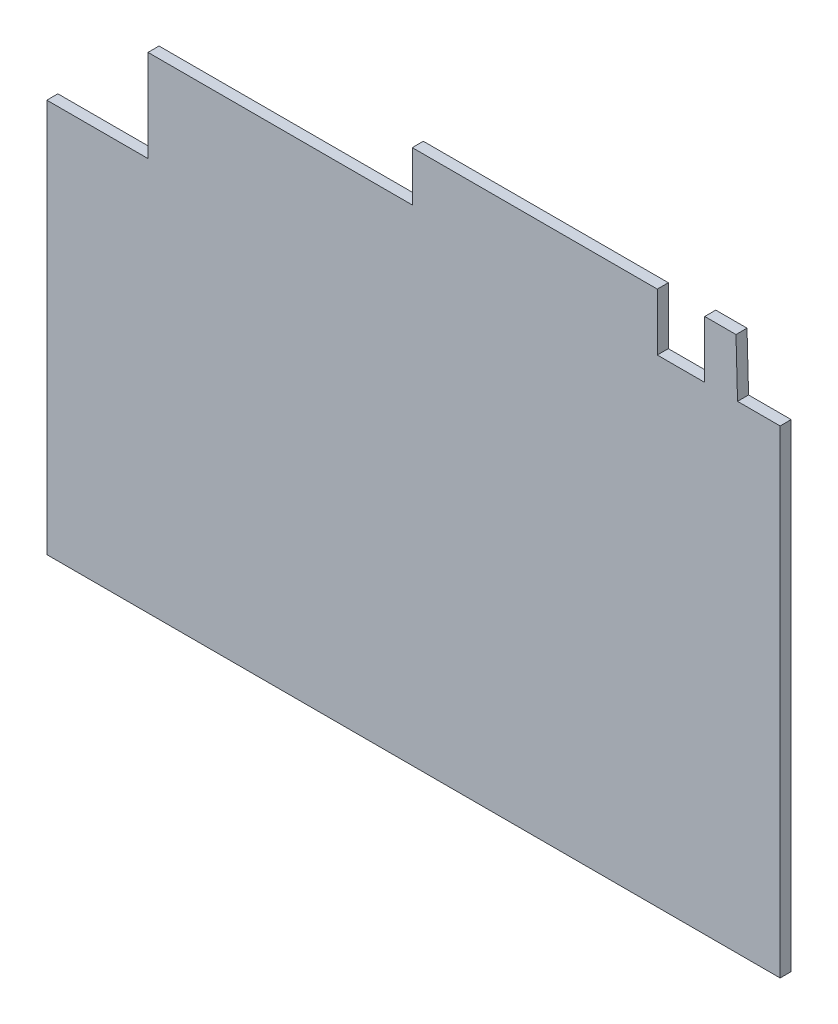
ISO-10303-21;
HEADER;
FILE_DESCRIPTION(('STEP AP214'),'2;1');
FILE_NAME('part.step','',(''),(''),'','','');
FILE_SCHEMA(('AUTOMOTIVE_DESIGN { 1 0 10303 214 1 1 1 1 }'));
ENDSEC;
DATA;
#1=APPLICATION_CONTEXT('core data for automotive mechanical design processes');
#2=APPLICATION_PROTOCOL_DEFINITION('international standard','automotive_design',2000,#1);
#3=PRODUCT_CONTEXT('',#1,'mechanical');
#4=PRODUCT('Part','Part','',(#3));
#5=PRODUCT_RELATED_PRODUCT_CATEGORY('part','',(#4));
#6=PRODUCT_DEFINITION_FORMATION('','',#4);
#7=PRODUCT_DEFINITION_CONTEXT('part definition',#1,'design');
#8=PRODUCT_DEFINITION('design','',#6,#7);
#9=PRODUCT_DEFINITION_SHAPE('','',#8);
#10=(LENGTH_UNIT() NAMED_UNIT(*) SI_UNIT(.MILLI.,.METRE.));
#11=(NAMED_UNIT(*) PLANE_ANGLE_UNIT() SI_UNIT($,.RADIAN.));
#12=(NAMED_UNIT(*) SI_UNIT($,.STERADIAN.) SOLID_ANGLE_UNIT());
#13=UNCERTAINTY_MEASURE_WITH_UNIT(LENGTH_MEASURE(1.E-05),#10,'distance_accuracy_value','');
#14=(GEOMETRIC_REPRESENTATION_CONTEXT(3) GLOBAL_UNCERTAINTY_ASSIGNED_CONTEXT((#13)) GLOBAL_UNIT_ASSIGNED_CONTEXT((#10,
#11,#12)) REPRESENTATION_CONTEXT('',''));
#15=CARTESIAN_POINT('',(0.,0.,0.));
#16=DIRECTION('',(0.,0.,1.));
#17=DIRECTION('',(1.,0.,0.));
#18=AXIS2_PLACEMENT_3D('',#15,#16,#17);
#19=CARTESIAN_POINT('',(28.5714285714286,236.06020224505,6.));
#20=DIRECTION('',(-1.,0.,0.));
#21=DIRECTION('',(0.,0.,1.));
#22=AXIS2_PLACEMENT_3D('',#19,#20,#21);
#23=PLANE('',#22);
#24=DIRECTION('',(0.,1.,0.));
#25=VECTOR('',#24,1.);
#26=CARTESIAN_POINT('',(28.5714285714286,236.06020224505,0.));
#27=LINE('',#26,#25);
#28=CARTESIAN_POINT('',(28.5714285714282,-22.8952380952381,0.));
#29=VERTEX_POINT('',#28);
#30=CARTESIAN_POINT('',(28.5714285714286,237.051840480238,0.));
#31=VERTEX_POINT('',#30);
#32=EDGE_CURVE('E98',#29,#31,#27,.T.);
#33=ORIENTED_EDGE('',*,*,#32,.T.);
#34=DIRECTION('',(0.,0.,-1.));
#35=VECTOR('',#34,1.);
#36=CARTESIAN_POINT('',(28.5714285714286,237.051840480238,6.));
#37=LINE('',#36,#35);
#38=CARTESIAN_POINT('',(28.5714285714286,237.051840480238,6.));
#39=VERTEX_POINT('',#38);
#40=EDGE_CURVE('E210',#39,#31,#37,.T.);
#41=ORIENTED_EDGE('',*,*,#40,.F.);
#42=DIRECTION('',(0.,1.,0.));
#43=VECTOR('',#42,1.);
#44=CARTESIAN_POINT('',(28.5714285714282,-22.8952380952381,6.));
#45=LINE('',#44,#43);
#46=CARTESIAN_POINT('',(28.5714285714282,-22.8952380952381,6.));
#47=VERTEX_POINT('',#46);
#48=EDGE_CURVE('E104',#47,#39,#45,.T.);
#49=ORIENTED_EDGE('',*,*,#48,.F.);
#50=DIRECTION('',(0.,0.,-1.));
#51=VECTOR('',#50,1.);
#52=CARTESIAN_POINT('',(28.5714285714282,-22.8952380952381,6.));
#53=LINE('',#52,#51);
#54=EDGE_CURVE('E164',#47,#29,#53,.T.);
#55=ORIENTED_EDGE('',*,*,#54,.T.);
#56=EDGE_LOOP('',(#33,#41,#49,#55));
#57=FACE_BOUND('',#56,.T.);
#58=ADVANCED_FACE('F33',(#57),#23,.F.);
#59=CARTESIAN_POINT('',(28.5714285714286,237.051840480238,6.));
#60=DIRECTION('',(0.,-1.,0.));
#61=DIRECTION('',(0.,0.,-1.));
#62=AXIS2_PLACEMENT_3D('',#59,#60,#61);
#63=PLANE('',#62);
#64=DIRECTION('',(-1.,0.,0.));
#65=VECTOR('',#64,1.);
#66=CARTESIAN_POINT('',(28.5714285714286,237.051840480238,0.));
#67=LINE('',#66,#65);
#68=CARTESIAN_POINT('',(5.41548643614652,237.051840480238,0.));
#69=VERTEX_POINT('',#68);
#70=EDGE_CURVE('E166',#31,#69,#67,.T.);
#71=ORIENTED_EDGE('',*,*,#70,.T.);
#72=DIRECTION('',(0.,0.,-1.));
#73=VECTOR('',#72,1.);
#74=CARTESIAN_POINT('',(5.41548643614652,237.051840480238,6.));
#75=LINE('',#74,#73);
#76=CARTESIAN_POINT('',(5.41548643614652,237.051840480238,6.));
#77=VERTEX_POINT('',#76);
#78=EDGE_CURVE('E207',#77,#69,#75,.T.);
#79=ORIENTED_EDGE('',*,*,#78,.F.);
#80=DIRECTION('',(-1.,0.,0.));
#81=VECTOR('',#80,1.);
#82=CARTESIAN_POINT('',(28.5714285714286,237.051840480238,6.));
#83=LINE('',#82,#81);
#84=EDGE_CURVE('E235',#39,#77,#83,.T.);
#85=ORIENTED_EDGE('',*,*,#84,.F.);
#86=ORIENTED_EDGE('',*,*,#40,.T.);
#87=EDGE_LOOP('',(#71,#79,#85,#86));
#88=FACE_BOUND('',#87,.T.);
#89=ADVANCED_FACE('F269',(#88),#63,.F.);
#90=CARTESIAN_POINT('',(5.41548643614652,237.051840480238,6.));
#91=DIRECTION('',(-0.99963079383079,-0.0271712352539165,0.));
#92=DIRECTION('',(0.0271712352539165,-0.99963079383079,0.));
#93=AXIS2_PLACEMENT_3D('',#90,#91,#92);
#94=PLANE('',#93);
#95=DIRECTION('',(-0.0271712352539165,0.999630793830791,0.));
#96=VECTOR('',#95,1.);
#97=CARTESIAN_POINT('',(5.41548643614652,237.051840480238,0.));
#98=LINE('',#97,#96);
#99=CARTESIAN_POINT('',(4.57142857142857,268.104761904762,0.));
#100=VERTEX_POINT('',#99);
#101=EDGE_CURVE('E168',#69,#100,#98,.T.);
#102=ORIENTED_EDGE('',*,*,#101,.T.);
#103=DIRECTION('',(0.,0.,-1.));
#104=VECTOR('',#103,1.);
#105=CARTESIAN_POINT('',(4.57142857142857,268.104761904762,6.));
#106=LINE('',#105,#104);
#107=CARTESIAN_POINT('',(4.57142857142857,268.104761904762,6.));
#108=VERTEX_POINT('',#107);
#109=EDGE_CURVE('E204',#108,#100,#106,.T.);
#110=ORIENTED_EDGE('',*,*,#109,.F.);
#111=DIRECTION('',(-0.0271712352539165,0.999630793830791,0.));
#112=VECTOR('',#111,1.);
#113=CARTESIAN_POINT('',(5.41548643614652,237.051840480238,6.));
#114=LINE('',#113,#112);
#115=EDGE_CURVE('E237',#77,#108,#114,.T.);
#116=ORIENTED_EDGE('',*,*,#115,.F.);
#117=ORIENTED_EDGE('',*,*,#78,.T.);
#118=EDGE_LOOP('',(#102,#110,#116,#117));
#119=FACE_BOUND('',#118,.T.);
#120=ADVANCED_FACE('F275',(#119),#94,.F.);
#121=CARTESIAN_POINT('',(4.57142857142857,268.104761904762,6.));
#122=DIRECTION('',(0.,-1.,0.));
#123=DIRECTION('',(0.,0.,-1.));
#124=AXIS2_PLACEMENT_3D('',#121,#122,#123);
#125=PLANE('',#124);
#126=DIRECTION('',(-1.,0.,0.));
#127=VECTOR('',#126,1.);
#128=CARTESIAN_POINT('',(4.57142857142857,268.104761904762,0.));
#129=LINE('',#128,#127);
#130=CARTESIAN_POINT('',(-12.4285714285714,268.104761904762,0.));
#131=VERTEX_POINT('',#130);
#132=EDGE_CURVE('E170',#100,#131,#129,.T.);
#133=ORIENTED_EDGE('',*,*,#132,.T.);
#134=DIRECTION('',(0.,0.,-1.));
#135=VECTOR('',#134,1.);
#136=CARTESIAN_POINT('',(-12.4285714285714,268.104761904762,6.));
#137=LINE('',#136,#135);
#138=CARTESIAN_POINT('',(-12.4285714285714,268.104761904762,6.));
#139=VERTEX_POINT('',#138);
#140=EDGE_CURVE('E201',#139,#131,#137,.T.);
#141=ORIENTED_EDGE('',*,*,#140,.F.);
#142=DIRECTION('',(-1.,0.,0.));
#143=VECTOR('',#142,1.);
#144=CARTESIAN_POINT('',(4.57142857142857,268.104761904762,6.));
#145=LINE('',#144,#143);
#146=EDGE_CURVE('E239',#108,#139,#145,.T.);
#147=ORIENTED_EDGE('',*,*,#146,.F.);
#148=ORIENTED_EDGE('',*,*,#109,.T.);
#149=EDGE_LOOP('',(#133,#141,#147,#148));
#150=FACE_BOUND('',#149,.T.);
#151=ADVANCED_FACE('F279',(#150),#125,.F.);
#152=CARTESIAN_POINT('',(-12.4285714285714,268.104761904762,6.));
#153=DIRECTION('',(1.,0.,0.));
#154=DIRECTION('',(0.,0.,-1.));
#155=AXIS2_PLACEMENT_3D('',#152,#153,#154);
#156=PLANE('',#155);
#157=DIRECTION('',(0.,-1.,0.));
#158=VECTOR('',#157,1.);
#159=CARTESIAN_POINT('',(-12.4285714285714,268.104761904762,0.));
#160=LINE('',#159,#158);
#161=CARTESIAN_POINT('',(-12.4285714285714,237.051840480238,0.));
#162=VERTEX_POINT('',#161);
#163=EDGE_CURVE('E172',#131,#162,#160,.T.);
#164=ORIENTED_EDGE('',*,*,#163,.T.);
#165=DIRECTION('',(0.,0.,-1.));
#166=VECTOR('',#165,1.);
#167=CARTESIAN_POINT('',(-12.4285714285714,237.051840480238,6.));
#168=LINE('',#167,#166);
#169=CARTESIAN_POINT('',(-12.4285714285714,237.051840480238,6.));
#170=VERTEX_POINT('',#169);
#171=EDGE_CURVE('E198',#170,#162,#168,.T.);
#172=ORIENTED_EDGE('',*,*,#171,.F.);
#173=DIRECTION('',(0.,-1.,0.));
#174=VECTOR('',#173,1.);
#175=CARTESIAN_POINT('',(-12.4285714285714,268.104761904762,6.));
#176=LINE('',#175,#174);
#177=EDGE_CURVE('E241',#139,#170,#176,.T.);
#178=ORIENTED_EDGE('',*,*,#177,.F.);
#179=ORIENTED_EDGE('',*,*,#140,.T.);
#180=EDGE_LOOP('',(#164,#172,#178,#179));
#181=FACE_BOUND('',#180,.T.);
#182=ADVANCED_FACE('F284',(#181),#156,.F.);
#183=CARTESIAN_POINT('',(-12.4285714285714,237.051840480238,6.));
#184=DIRECTION('',(0.,-1.,0.));
#185=DIRECTION('',(0.,0.,-1.));
#186=AXIS2_PLACEMENT_3D('',#183,#184,#185);
#187=PLANE('',#186);
#188=DIRECTION('',(-1.,0.,0.));
#189=VECTOR('',#188,1.);
#190=CARTESIAN_POINT('',(-12.4285714285714,237.051840480238,0.));
#191=LINE('',#190,#189);
#192=CARTESIAN_POINT('',(-38.2165959121275,237.051840480238,0.));
#193=VERTEX_POINT('',#192);
#194=EDGE_CURVE('E174',#162,#193,#191,.T.);
#195=ORIENTED_EDGE('',*,*,#194,.T.);
#196=DIRECTION('',(0.,0.,-1.));
#197=VECTOR('',#196,1.);
#198=CARTESIAN_POINT('',(-38.2165959121275,237.051840480238,6.));
#199=LINE('',#198,#197);
#200=CARTESIAN_POINT('',(-38.2165959121275,237.051840480238,6.));
#201=VERTEX_POINT('',#200);
#202=EDGE_CURVE('E195',#201,#193,#199,.T.);
#203=ORIENTED_EDGE('',*,*,#202,.F.);
#204=DIRECTION('',(-1.,0.,0.));
#205=VECTOR('',#204,1.);
#206=CARTESIAN_POINT('',(-12.4285714285714,237.051840480238,6.));
#207=LINE('',#206,#205);
#208=EDGE_CURVE('E243',#170,#201,#207,.T.);
#209=ORIENTED_EDGE('',*,*,#208,.F.);
#210=ORIENTED_EDGE('',*,*,#171,.T.);
#211=EDGE_LOOP('',(#195,#203,#209,#210));
#212=FACE_BOUND('',#211,.T.);
#213=ADVANCED_FACE('F287',(#212),#187,.F.);
#214=CARTESIAN_POINT('',(-38.2165959121275,237.051840480238,6.));
#215=DIRECTION('',(-1.,0.,0.));
#216=DIRECTION('',(0.,-1.,0.));
#217=AXIS2_PLACEMENT_3D('',#214,#215,#216);
#218=PLANE('',#217);
#219=DIRECTION('',(0.,1.,0.));
#220=VECTOR('',#219,1.);
#221=CARTESIAN_POINT('',(-38.2165959121275,237.051840480238,0.));
#222=LINE('',#221,#220);
#223=CARTESIAN_POINT('',(-38.2165959121275,268.104761904762,0.));
#224=VERTEX_POINT('',#223);
#225=EDGE_CURVE('E176',#193,#224,#222,.T.);
#226=ORIENTED_EDGE('',*,*,#225,.T.);
#227=DIRECTION('',(0.,0.,-1.));
#228=VECTOR('',#227,1.);
#229=CARTESIAN_POINT('',(-38.2165959121275,268.104761904762,6.));
#230=LINE('',#229,#228);
#231=CARTESIAN_POINT('',(-38.2165959121275,268.104761904762,6.));
#232=VERTEX_POINT('',#231);
#233=EDGE_CURVE('E192',#232,#224,#230,.T.);
#234=ORIENTED_EDGE('',*,*,#233,.F.);
#235=DIRECTION('',(0.,1.,0.));
#236=VECTOR('',#235,1.);
#237=CARTESIAN_POINT('',(-38.2165959121275,237.051840480238,6.));
#238=LINE('',#237,#236);
#239=EDGE_CURVE('E245',#201,#232,#238,.T.);
#240=ORIENTED_EDGE('',*,*,#239,.F.);
#241=ORIENTED_EDGE('',*,*,#202,.T.);
#242=EDGE_LOOP('',(#226,#234,#240,#241));
#243=FACE_BOUND('',#242,.T.);
#244=ADVANCED_FACE('F251',(#243),#218,.F.);
#245=CARTESIAN_POINT('',(-38.2165959121275,268.104761904762,6.));
#246=DIRECTION('',(0.,-1.,0.));
#247=DIRECTION('',(1.,0.,0.));
#248=AXIS2_PLACEMENT_3D('',#245,#246,#247);
#249=PLANE('',#248);
#250=DIRECTION('',(-1.,0.,0.));
#251=VECTOR('',#250,1.);
#252=CARTESIAN_POINT('',(-38.2165959121275,268.104761904762,0.));
#253=LINE('',#252,#251);
#254=CARTESIAN_POINT('',(-171.428571428571,268.104761904762,0.));
#255=VERTEX_POINT('',#254);
#256=EDGE_CURVE('E178',#224,#255,#253,.T.);
#257=ORIENTED_EDGE('',*,*,#256,.T.);
#258=DIRECTION('',(0.,0.,-1.));
#259=VECTOR('',#258,1.);
#260=CARTESIAN_POINT('',(-171.428571428571,268.104761904762,6.));
#261=LINE('',#260,#259);
#262=CARTESIAN_POINT('',(-171.428571428571,268.104761904762,6.));
#263=VERTEX_POINT('',#262);
#264=EDGE_CURVE('E151',#263,#255,#261,.T.);
#265=ORIENTED_EDGE('',*,*,#264,.F.);
#266=DIRECTION('',(-1.,0.,0.));
#267=VECTOR('',#266,1.);
#268=CARTESIAN_POINT('',(-38.2165959121275,268.104761904762,6.));
#269=LINE('',#268,#267);
#270=EDGE_CURVE('E138',#232,#263,#269,.T.);
#271=ORIENTED_EDGE('',*,*,#270,.F.);
#272=ORIENTED_EDGE('',*,*,#233,.T.);
#273=EDGE_LOOP('',(#257,#265,#271,#272));
#274=FACE_BOUND('',#273,.T.);
#275=ADVANCED_FACE('F255',(#274),#249,.F.);
#276=CARTESIAN_POINT('',(-171.428571428571,268.104761904762,6.));
#277=DIRECTION('',(1.,0.,0.));
#278=DIRECTION('',(0.,1.,0.));
#279=AXIS2_PLACEMENT_3D('',#276,#277,#278);
#280=PLANE('',#279);
#281=DIRECTION('',(0.,-1.,0.));
#282=VECTOR('',#281,1.);
#283=CARTESIAN_POINT('',(-171.428571428571,268.104761904762,0.));
#284=LINE('',#283,#282);
#285=CARTESIAN_POINT('',(-171.428571428571,241.104761904762,0.));
#286=VERTEX_POINT('',#285);
#287=EDGE_CURVE('E147',#255,#286,#284,.T.);
#288=ORIENTED_EDGE('',*,*,#287,.T.);
#289=DIRECTION('',(0.,0.,-1.));
#290=VECTOR('',#289,1.);
#291=CARTESIAN_POINT('',(-171.428571428571,241.104761904762,6.));
#292=LINE('',#291,#290);
#293=CARTESIAN_POINT('',(-171.428571428571,241.104761904762,6.));
#294=VERTEX_POINT('',#293);
#295=EDGE_CURVE('E144',#294,#286,#292,.T.);
#296=ORIENTED_EDGE('',*,*,#295,.F.);
#297=DIRECTION('',(0.,-1.,0.));
#298=VECTOR('',#297,1.);
#299=CARTESIAN_POINT('',(-171.428571428571,268.104761904762,6.));
#300=LINE('',#299,#298);
#301=EDGE_CURVE('E130',#263,#294,#300,.T.);
#302=ORIENTED_EDGE('',*,*,#301,.F.);
#303=ORIENTED_EDGE('',*,*,#264,.T.);
#304=EDGE_LOOP('',(#288,#296,#302,#303));
#305=FACE_BOUND('',#304,.T.);
#306=ADVANCED_FACE('F145',(#305),#280,.F.);
#307=CARTESIAN_POINT('',(-171.428571428571,241.104761904762,6.));
#308=DIRECTION('',(0.,-1.,0.));
#309=DIRECTION('',(1.,0.,0.));
#310=AXIS2_PLACEMENT_3D('',#307,#308,#309);
#311=PLANE('',#310);
#312=DIRECTION('',(-1.,0.,0.));
#313=VECTOR('',#312,1.);
#314=CARTESIAN_POINT('',(-171.428571428571,241.104761904762,0.));
#315=LINE('',#314,#313);
#316=CARTESIAN_POINT('',(-315.123537573958,241.104761904762,0.));
#317=VERTEX_POINT('',#316);
#318=EDGE_CURVE('E181',#286,#317,#315,.T.);
#319=ORIENTED_EDGE('',*,*,#318,.T.);
#320=DIRECTION('',(0.,0.,1.));
#321=VECTOR('',#320,1.);
#322=CARTESIAN_POINT('',(-315.123537573958,241.104761904762,-4.));
#323=LINE('',#322,#321);
#324=CARTESIAN_POINT('',(-315.123537573958,241.104761904762,6.));
#325=VERTEX_POINT('',#324);
#326=EDGE_CURVE('E157',#317,#325,#323,.T.);
#327=ORIENTED_EDGE('',*,*,#326,.T.);
#328=DIRECTION('',(-1.,0.,0.));
#329=VECTOR('',#328,1.);
#330=CARTESIAN_POINT('',(-171.428571428571,241.104761904762,6.));
#331=LINE('',#330,#329);
#332=EDGE_CURVE('E136',#294,#325,#331,.T.);
#333=ORIENTED_EDGE('',*,*,#332,.F.);
#334=ORIENTED_EDGE('',*,*,#295,.T.);
#335=EDGE_LOOP('',(#319,#327,#333,#334));
#336=FACE_BOUND('',#335,.T.);
#337=ADVANCED_FACE('F155',(#336),#311,.F.);
#338=CARTESIAN_POINT('',(-370.123537573958,241.104761904762,6.));
#339=DIRECTION('',(1.,0.,0.));
#340=DIRECTION('',(0.,1.,0.));
#341=AXIS2_PLACEMENT_3D('',#338,#339,#340);
#342=PLANE('',#341);
#343=DIRECTION('',(0.,-1.,0.));
#344=VECTOR('',#343,1.);
#345=CARTESIAN_POINT('',(-370.123537573958,241.104761904762,6.));
#346=LINE('',#345,#344);
#347=CARTESIAN_POINT('',(-370.123537573958,191.104761904762,6.));
#348=VERTEX_POINT('',#347);
#349=CARTESIAN_POINT('',(-370.123537573958,-22.8952380952382,6.));
#350=VERTEX_POINT('',#349);
#351=EDGE_CURVE('E158',#348,#350,#346,.T.);
#352=ORIENTED_EDGE('',*,*,#351,.F.);
#353=DIRECTION('',(0.,0.,1.));
#354=VECTOR('',#353,1.);
#355=CARTESIAN_POINT('',(-370.123537573958,191.104761904762,-4.));
#356=LINE('',#355,#354);
#357=CARTESIAN_POINT('',(-370.123537573958,191.104761904762,0.));
#358=VERTEX_POINT('',#357);
#359=EDGE_CURVE('E220',#358,#348,#356,.T.);
#360=ORIENTED_EDGE('',*,*,#359,.F.);
#361=DIRECTION('',(0.,-1.,0.));
#362=VECTOR('',#361,1.);
#363=CARTESIAN_POINT('',(-370.123537573958,241.104761904762,0.));
#364=LINE('',#363,#362);
#365=CARTESIAN_POINT('',(-370.123537573958,-22.8952380952382,0.));
#366=VERTEX_POINT('',#365);
#367=EDGE_CURVE('E183',#358,#366,#364,.T.);
#368=ORIENTED_EDGE('',*,*,#367,.T.);
#369=DIRECTION('',(0.,0.,-1.));
#370=VECTOR('',#369,1.);
#371=CARTESIAN_POINT('',(-370.123537573958,-22.8952380952382,6.));
#372=LINE('',#371,#370);
#373=EDGE_CURVE('E152',#350,#366,#372,.T.);
#374=ORIENTED_EDGE('',*,*,#373,.F.);
#375=EDGE_LOOP('',(#352,#360,#368,#374));
#376=FACE_BOUND('',#375,.T.);
#377=ADVANCED_FACE('F224',(#376),#342,.F.);
#378=CARTESIAN_POINT('',(-370.123537573958,-22.8952380952382,6.));
#379=DIRECTION('',(0.,1.,0.));
#380=DIRECTION('',(-1.,0.,0.));
#381=AXIS2_PLACEMENT_3D('',#378,#379,#380);
#382=PLANE('',#381);
#383=DIRECTION('',(1.,0.,0.));
#384=VECTOR('',#383,1.);
#385=CARTESIAN_POINT('',(-370.123537573958,-22.8952380952382,0.));
#386=LINE('',#385,#384);
#387=EDGE_CURVE('E185',#366,#29,#386,.T.);
#388=ORIENTED_EDGE('',*,*,#387,.T.);
#389=ORIENTED_EDGE('',*,*,#54,.F.);
#390=DIRECTION('',(1.,0.,0.));
#391=VECTOR('',#390,1.);
#392=CARTESIAN_POINT('',(-370.123537573958,-22.8952380952382,6.));
#393=LINE('',#392,#391);
#394=EDGE_CURVE('E56',#350,#47,#393,.T.);
#395=ORIENTED_EDGE('',*,*,#394,.F.);
#396=ORIENTED_EDGE('',*,*,#373,.T.);
#397=EDGE_LOOP('',(#388,#389,#395,#396));
#398=FACE_BOUND('',#397,.T.);
#399=ADVANCED_FACE('F264',(#398),#382,.F.);
#400=CARTESIAN_POINT('',(0.,0.,6.));
#401=DIRECTION('',(0.,0.,1.));
#402=DIRECTION('',(1.,0.,0.));
#403=AXIS2_PLACEMENT_3D('',#400,#401,#402);
#404=PLANE('',#403);
#405=DIRECTION('',(0.,1.,0.));
#406=VECTOR('',#405,1.);
#407=CARTESIAN_POINT('',(-315.123537573958,241.104761904762,6.));
#408=LINE('',#407,#406);
#409=CARTESIAN_POINT('',(-315.123537573958,191.104761904762,6.));
#410=VERTEX_POINT('',#409);
#411=EDGE_CURVE('E226',#410,#325,#408,.T.);
#412=ORIENTED_EDGE('',*,*,#411,.F.);
#413=DIRECTION('',(1.,0.,0.));
#414=VECTOR('',#413,1.);
#415=CARTESIAN_POINT('',(-370.123537573958,191.104761904762,6.));
#416=LINE('',#415,#414);
#417=EDGE_CURVE('E230',#348,#410,#416,.T.);
#418=ORIENTED_EDGE('',*,*,#417,.F.);
#419=ORIENTED_EDGE('',*,*,#351,.T.);
#420=ORIENTED_EDGE('',*,*,#394,.T.);
#421=ORIENTED_EDGE('',*,*,#48,.T.);
#422=ORIENTED_EDGE('',*,*,#84,.T.);
#423=ORIENTED_EDGE('',*,*,#115,.T.);
#424=ORIENTED_EDGE('',*,*,#146,.T.);
#425=ORIENTED_EDGE('',*,*,#177,.T.);
#426=ORIENTED_EDGE('',*,*,#208,.T.);
#427=ORIENTED_EDGE('',*,*,#239,.T.);
#428=ORIENTED_EDGE('',*,*,#270,.T.);
#429=ORIENTED_EDGE('',*,*,#301,.T.);
#430=ORIENTED_EDGE('',*,*,#332,.T.);
#431=EDGE_LOOP('',(#412,#418,#419,#420,#421,#422,#423,#424,#425,#426,#427,#428,#429,#430));
#432=FACE_BOUND('',#431,.T.);
#433=ADVANCED_FACE('F133',(#432),#404,.T.);
#434=CARTESIAN_POINT('',(0.,0.,0.));
#435=DIRECTION('',(0.,0.,1.));
#436=DIRECTION('',(1.,0.,0.));
#437=AXIS2_PLACEMENT_3D('',#434,#435,#436);
#438=PLANE('',#437);
#439=DIRECTION('',(1.,0.,0.));
#440=VECTOR('',#439,1.);
#441=CARTESIAN_POINT('',(0.,191.104761904762,0.));
#442=LINE('',#441,#440);
#443=CARTESIAN_POINT('',(-315.123537573958,191.104761904762,0.));
#444=VERTEX_POINT('',#443);
#445=EDGE_CURVE('E40',#358,#444,#442,.T.);
#446=ORIENTED_EDGE('',*,*,#445,.T.);
#447=DIRECTION('',(0.,1.,0.));
#448=VECTOR('',#447,1.);
#449=CARTESIAN_POINT('',(-315.123537573958,-3.49857407015939E-13,0.));
#450=LINE('',#449,#448);
#451=EDGE_CURVE('E11',#444,#317,#450,.T.);
#452=ORIENTED_EDGE('',*,*,#451,.T.);
#453=ORIENTED_EDGE('',*,*,#318,.F.);
#454=ORIENTED_EDGE('',*,*,#287,.F.);
#455=ORIENTED_EDGE('',*,*,#256,.F.);
#456=ORIENTED_EDGE('',*,*,#225,.F.);
#457=ORIENTED_EDGE('',*,*,#194,.F.);
#458=ORIENTED_EDGE('',*,*,#163,.F.);
#459=ORIENTED_EDGE('',*,*,#132,.F.);
#460=ORIENTED_EDGE('',*,*,#101,.F.);
#461=ORIENTED_EDGE('',*,*,#70,.F.);
#462=ORIENTED_EDGE('',*,*,#32,.F.);
#463=ORIENTED_EDGE('',*,*,#387,.F.);
#464=ORIENTED_EDGE('',*,*,#367,.F.);
#465=EDGE_LOOP('',(#446,#452,#453,#454,#455,#456,#457,#458,#459,#460,#461,#462,#463,#464));
#466=FACE_BOUND('',#465,.T.);
#467=ADVANCED_FACE('F214',(#466),#438,.F.);
#468=CARTESIAN_POINT('',(-315.123537573958,241.104761904762,-4.));
#469=DIRECTION('',(1.,0.,0.));
#470=DIRECTION('',(0.,1.,0.));
#471=AXIS2_PLACEMENT_3D('',#468,#469,#470);
#472=PLANE('',#471);
#473=DIRECTION('',(0.,0.,1.));
#474=VECTOR('',#473,1.);
#475=CARTESIAN_POINT('',(-315.123537573958,191.104761904762,-4.));
#476=LINE('',#475,#474);
#477=EDGE_CURVE('E47',#444,#410,#476,.T.);
#478=ORIENTED_EDGE('',*,*,#477,.T.);
#479=ORIENTED_EDGE('',*,*,#411,.T.);
#480=ORIENTED_EDGE('',*,*,#326,.F.);
#481=ORIENTED_EDGE('',*,*,#451,.F.);
#482=EDGE_LOOP('',(#478,#479,#480,#481));
#483=FACE_BOUND('',#482,.T.);
#484=ADVANCED_FACE('F257',(#483),#472,.F.);
#485=CARTESIAN_POINT('',(-370.123537573958,191.104761904762,-4.));
#486=DIRECTION('',(0.,-1.,0.));
#487=DIRECTION('',(0.,0.,-1.));
#488=AXIS2_PLACEMENT_3D('',#485,#486,#487);
#489=PLANE('',#488);
#490=ORIENTED_EDGE('',*,*,#359,.T.);
#491=ORIENTED_EDGE('',*,*,#417,.T.);
#492=ORIENTED_EDGE('',*,*,#477,.F.);
#493=ORIENTED_EDGE('',*,*,#445,.F.);
#494=EDGE_LOOP('',(#490,#491,#492,#493));
#495=FACE_BOUND('',#494,.T.);
#496=ADVANCED_FACE('F218',(#495),#489,.F.);
#497=CLOSED_SHELL('',(#58,#89,#120,#151,#182,#213,#244,#275,#306,#337,#377,#399,#433,#467,#484,#496));
#498=MANIFOLD_SOLID_BREP('B2',#497);
#499=ADVANCED_BREP_SHAPE_REPRESENTATION('',(#18,#498),#14);
#500=SHAPE_DEFINITION_REPRESENTATION(#9,#499);
ENDSEC;
END-ISO-10303-21;
